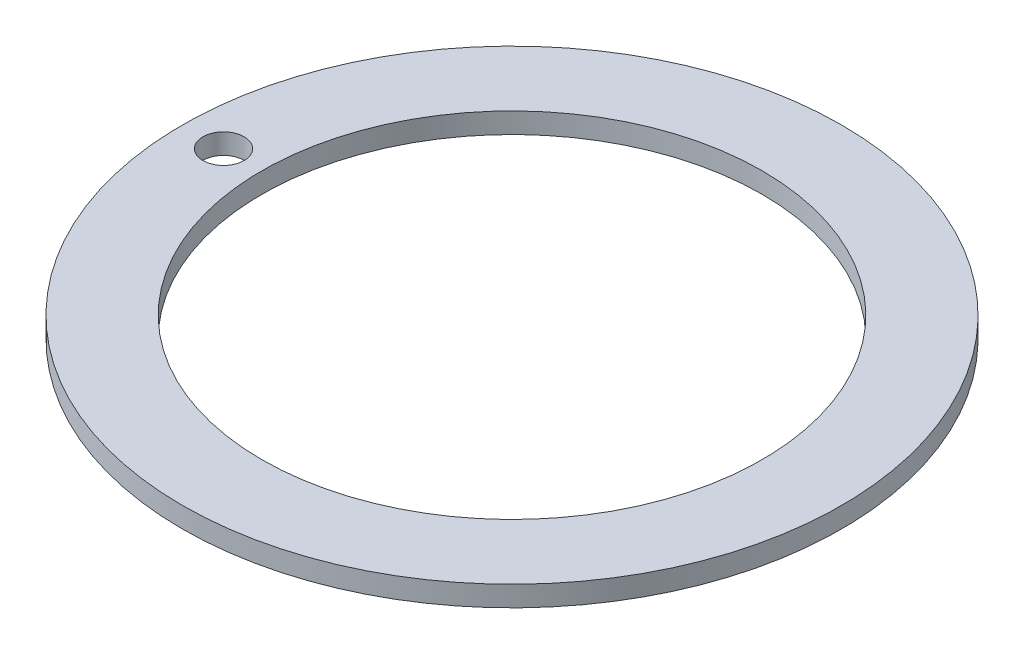
ISO-10303-21;
HEADER;
FILE_DESCRIPTION(('STEP AP214'),'2;1');
FILE_NAME('part.step','',(''),(''),'','','');
FILE_SCHEMA(('AUTOMOTIVE_DESIGN { 1 0 10303 214 1 1 1 1 }'));
ENDSEC;
DATA;
#1=APPLICATION_CONTEXT('core data for automotive mechanical design processes');
#2=APPLICATION_PROTOCOL_DEFINITION('international standard','automotive_design',2000,#1);
#3=PRODUCT_CONTEXT('',#1,'mechanical');
#4=PRODUCT('Part','Part','',(#3));
#5=PRODUCT_RELATED_PRODUCT_CATEGORY('part','',(#4));
#6=PRODUCT_DEFINITION_FORMATION('','',#4);
#7=PRODUCT_DEFINITION_CONTEXT('part definition',#1,'design');
#8=PRODUCT_DEFINITION('design','',#6,#7);
#9=PRODUCT_DEFINITION_SHAPE('','',#8);
#10=(LENGTH_UNIT() NAMED_UNIT(*) SI_UNIT(.MILLI.,.METRE.));
#11=(NAMED_UNIT(*) PLANE_ANGLE_UNIT() SI_UNIT($,.RADIAN.));
#12=(NAMED_UNIT(*) SI_UNIT($,.STERADIAN.) SOLID_ANGLE_UNIT());
#13=UNCERTAINTY_MEASURE_WITH_UNIT(LENGTH_MEASURE(1.E-05),#10,'distance_accuracy_value','');
#14=(GEOMETRIC_REPRESENTATION_CONTEXT(3) GLOBAL_UNCERTAINTY_ASSIGNED_CONTEXT((#13)) GLOBAL_UNIT_ASSIGNED_CONTEXT((#10,
#11,#12)) REPRESENTATION_CONTEXT('',''));
#15=CARTESIAN_POINT('',(0.,0.,0.));
#16=DIRECTION('',(0.,0.,1.));
#17=DIRECTION('',(1.,0.,0.));
#18=AXIS2_PLACEMENT_3D('',#15,#16,#17);
#19=CARTESIAN_POINT('',(0.,2.3622,0.));
#20=DIRECTION('',(0.,1.,0.));
#21=DIRECTION('',(0.,0.,1.));
#22=AXIS2_PLACEMENT_3D('',#19,#20,#21);
#23=PLANE('',#22);
#24=CARTESIAN_POINT('',(-33.3299411428324,2.3622,0.));
#25=DIRECTION('',(0.,1.,0.));
#26=DIRECTION('',(0.,0.,1.));
#27=AXIS2_PLACEMENT_3D('',#24,#25,#26);
#28=CIRCLE('',#27,2.38125);
#29=CARTESIAN_POINT('',(-33.3299411428324,2.3622,2.38125));
#30=VERTEX_POINT('',#29);
#31=EDGE_CURVE('E67',#30,#30,#28,.T.);
#32=ORIENTED_EDGE('',*,*,#31,.F.);
#33=EDGE_LOOP('',(#32));
#34=FACE_BOUND('',#33,.T.);
#35=CARTESIAN_POINT('',(0.,2.3622,0.));
#36=DIRECTION('',(0.,1.,0.));
#37=DIRECTION('',(0.,0.,1.));
#38=AXIS2_PLACEMENT_3D('',#35,#36,#37);
#39=CIRCLE('',#38,38.0746);
#40=CARTESIAN_POINT('',(0.,2.3622,38.0746));
#41=VERTEX_POINT('',#40);
#42=EDGE_CURVE('E10',#41,#41,#39,.T.);
#43=ORIENTED_EDGE('',*,*,#42,.T.);
#44=EDGE_LOOP('',(#43));
#45=FACE_BOUND('',#44,.T.);
#46=CARTESIAN_POINT('',(0.,2.3622,0.));
#47=DIRECTION('',(0.,1.,0.));
#48=DIRECTION('',(0.,0.,1.));
#49=AXIS2_PLACEMENT_3D('',#46,#47,#48);
#50=CIRCLE('',#49,28.9052);
#51=CARTESIAN_POINT('',(0.,2.3622,28.9052));
#52=VERTEX_POINT('',#51);
#53=EDGE_CURVE('E58',#52,#52,#50,.T.);
#54=ORIENTED_EDGE('',*,*,#53,.F.);
#55=EDGE_LOOP('',(#54));
#56=FACE_BOUND('',#55,.T.);
#57=ADVANCED_FACE('F43',(#34,#45,#56),#23,.T.);
#58=CARTESIAN_POINT('',(0.,0.,0.));
#59=DIRECTION('',(0.,1.,0.));
#60=DIRECTION('',(0.,0.,1.));
#61=AXIS2_PLACEMENT_3D('',#58,#59,#60);
#62=PLANE('',#61);
#63=CARTESIAN_POINT('',(-33.3299411428324,0.,0.));
#64=DIRECTION('',(0.,1.,0.));
#65=DIRECTION('',(0.,0.,1.));
#66=AXIS2_PLACEMENT_3D('',#63,#64,#65);
#67=CIRCLE('',#66,2.38125);
#68=CARTESIAN_POINT('',(-33.3299411428324,0.,2.38125));
#69=VERTEX_POINT('',#68);
#70=EDGE_CURVE('E47',#69,#69,#67,.T.);
#71=ORIENTED_EDGE('',*,*,#70,.T.);
#72=EDGE_LOOP('',(#71));
#73=FACE_BOUND('',#72,.T.);
#74=CARTESIAN_POINT('',(0.,0.,0.));
#75=DIRECTION('',(0.,1.,0.));
#76=DIRECTION('',(0.,0.,1.));
#77=AXIS2_PLACEMENT_3D('',#74,#75,#76);
#78=CIRCLE('',#77,38.0746);
#79=CARTESIAN_POINT('',(0.,0.,38.0746));
#80=VERTEX_POINT('',#79);
#81=EDGE_CURVE('E52',#80,#80,#78,.T.);
#82=ORIENTED_EDGE('',*,*,#81,.F.);
#83=EDGE_LOOP('',(#82));
#84=FACE_BOUND('',#83,.T.);
#85=CARTESIAN_POINT('',(0.,0.,0.));
#86=DIRECTION('',(0.,1.,0.));
#87=DIRECTION('',(0.,0.,1.));
#88=AXIS2_PLACEMENT_3D('',#85,#86,#87);
#89=CIRCLE('',#88,28.9052);
#90=CARTESIAN_POINT('',(0.,0.,28.9052));
#91=VERTEX_POINT('',#90);
#92=EDGE_CURVE('E60',#91,#91,#89,.T.);
#93=ORIENTED_EDGE('',*,*,#92,.T.);
#94=EDGE_LOOP('',(#93));
#95=FACE_BOUND('',#94,.T.);
#96=ADVANCED_FACE('F76',(#73,#84,#95),#62,.F.);
#97=CARTESIAN_POINT('',(0.,2.3622,0.));
#98=DIRECTION('',(0.,-1.,0.));
#99=DIRECTION('',(0.,0.,-1.));
#100=AXIS2_PLACEMENT_3D('',#97,#98,#99);
#101=CYLINDRICAL_SURFACE('',#100,38.0746);
#102=ORIENTED_EDGE('',*,*,#42,.F.);
#103=EDGE_LOOP('',(#102));
#104=FACE_BOUND('',#103,.T.);
#105=ORIENTED_EDGE('',*,*,#81,.T.);
#106=EDGE_LOOP('',(#105));
#107=FACE_BOUND('',#106,.T.);
#108=ADVANCED_FACE('F45',(#104,#107),#101,.T.);
#109=CARTESIAN_POINT('',(0.,2.3622,0.));
#110=DIRECTION('',(0.,-1.,0.));
#111=DIRECTION('',(0.,0.,-1.));
#112=AXIS2_PLACEMENT_3D('',#109,#110,#111);
#113=CYLINDRICAL_SURFACE('',#112,28.9052);
#114=ORIENTED_EDGE('',*,*,#53,.T.);
#115=EDGE_LOOP('',(#114));
#116=FACE_BOUND('',#115,.T.);
#117=ORIENTED_EDGE('',*,*,#92,.F.);
#118=EDGE_LOOP('',(#117));
#119=FACE_BOUND('',#118,.T.);
#120=ADVANCED_FACE('F81',(#116,#119),#113,.F.);
#121=CARTESIAN_POINT('',(-33.3299411428324,-0.1778,0.));
#122=DIRECTION('',(0.,1.,0.));
#123=DIRECTION('',(0.,0.,1.));
#124=AXIS2_PLACEMENT_3D('',#121,#122,#123);
#125=CYLINDRICAL_SURFACE('',#124,2.38125);
#126=ORIENTED_EDGE('',*,*,#31,.T.);
#127=EDGE_LOOP('',(#126));
#128=FACE_BOUND('',#127,.T.);
#129=ORIENTED_EDGE('',*,*,#70,.F.);
#130=EDGE_LOOP('',(#129));
#131=FACE_BOUND('',#130,.T.);
#132=ADVANCED_FACE('F79',(#128,#131),#125,.F.);
#133=CLOSED_SHELL('',(#57,#96,#108,#120,#132));
#134=MANIFOLD_SOLID_BREP('B2',#133);
#135=ADVANCED_BREP_SHAPE_REPRESENTATION('',(#18,#134),#14);
#136=SHAPE_DEFINITION_REPRESENTATION(#9,#135);
ENDSEC;
END-ISO-10303-21;
